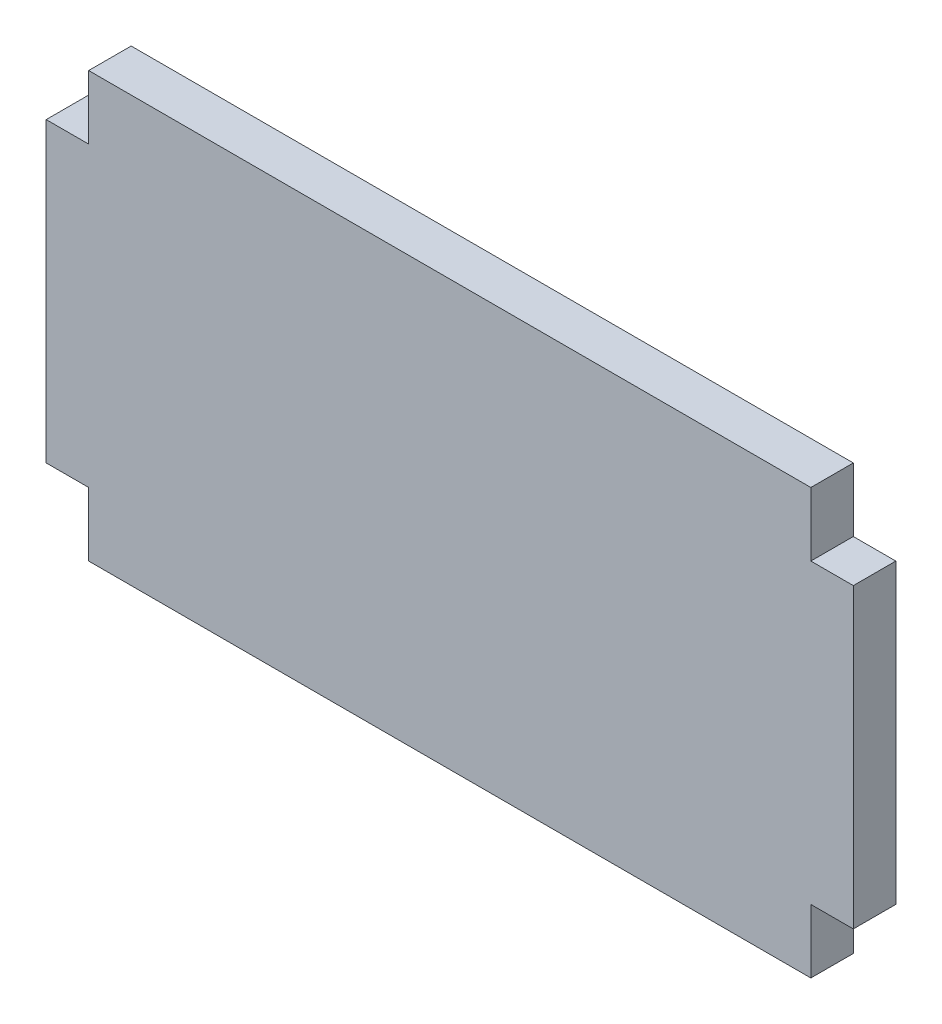
ISO-10303-21;
HEADER;
FILE_DESCRIPTION(('STEP AP214'),'2;1');
FILE_NAME('part.step','',(''),(''),'','','');
FILE_SCHEMA(('AUTOMOTIVE_DESIGN { 1 0 10303 214 1 1 1 1 }'));
ENDSEC;
DATA;
#1=APPLICATION_CONTEXT('core data for automotive mechanical design processes');
#2=APPLICATION_PROTOCOL_DEFINITION('international standard','automotive_design',2000,#1);
#3=PRODUCT_CONTEXT('',#1,'mechanical');
#4=PRODUCT('Part','Part','',(#3));
#5=PRODUCT_RELATED_PRODUCT_CATEGORY('part','',(#4));
#6=PRODUCT_DEFINITION_FORMATION('','',#4);
#7=PRODUCT_DEFINITION_CONTEXT('part definition',#1,'design');
#8=PRODUCT_DEFINITION('design','',#6,#7);
#9=PRODUCT_DEFINITION_SHAPE('','',#8);
#10=(LENGTH_UNIT() NAMED_UNIT(*) SI_UNIT(.MILLI.,.METRE.));
#11=(NAMED_UNIT(*) PLANE_ANGLE_UNIT() SI_UNIT($,.RADIAN.));
#12=(NAMED_UNIT(*) SI_UNIT($,.STERADIAN.) SOLID_ANGLE_UNIT());
#13=UNCERTAINTY_MEASURE_WITH_UNIT(LENGTH_MEASURE(1.E-05),#10,'distance_accuracy_value','');
#14=(GEOMETRIC_REPRESENTATION_CONTEXT(3) GLOBAL_UNCERTAINTY_ASSIGNED_CONTEXT((#13)) GLOBAL_UNIT_ASSIGNED_CONTEXT((#10,
#11,#12)) REPRESENTATION_CONTEXT('',''));
#15=CARTESIAN_POINT('',(0.,0.,0.));
#16=DIRECTION('',(0.,0.,1.));
#17=DIRECTION('',(1.,0.,0.));
#18=AXIS2_PLACEMENT_3D('',#15,#16,#17);
#19=CARTESIAN_POINT('',(42.5,17.5,5.));
#20=DIRECTION('',(-1.,0.,0.));
#21=DIRECTION('',(0.,0.,1.));
#22=AXIS2_PLACEMENT_3D('',#19,#20,#21);
#23=PLANE('',#22);
#24=DIRECTION('',(0.,1.,0.));
#25=VECTOR('',#24,1.);
#26=CARTESIAN_POINT('',(42.5,17.5,0.));
#27=LINE('',#26,#25);
#28=CARTESIAN_POINT('',(42.5,17.5,0.));
#29=VERTEX_POINT('',#28);
#30=CARTESIAN_POINT('',(42.5,25.,0.));
#31=VERTEX_POINT('',#30);
#32=EDGE_CURVE('E153',#29,#31,#27,.T.);
#33=ORIENTED_EDGE('',*,*,#32,.T.);
#34=DIRECTION('',(0.,0.,-1.));
#35=VECTOR('',#34,1.);
#36=CARTESIAN_POINT('',(42.5,25.,5.));
#37=LINE('',#36,#35);
#38=CARTESIAN_POINT('',(42.5,25.,5.));
#39=VERTEX_POINT('',#38);
#40=EDGE_CURVE('E11',#39,#31,#37,.T.);
#41=ORIENTED_EDGE('',*,*,#40,.F.);
#42=DIRECTION('',(0.,1.,0.));
#43=VECTOR('',#42,1.);
#44=CARTESIAN_POINT('',(42.5,17.5,5.));
#45=LINE('',#44,#43);
#46=CARTESIAN_POINT('',(42.5,17.5,5.));
#47=VERTEX_POINT('',#46);
#48=EDGE_CURVE('E175',#47,#39,#45,.T.);
#49=ORIENTED_EDGE('',*,*,#48,.F.);
#50=DIRECTION('',(0.,0.,-1.));
#51=VECTOR('',#50,1.);
#52=CARTESIAN_POINT('',(42.5,17.5,5.));
#53=LINE('',#52,#51);
#54=EDGE_CURVE('E149',#47,#29,#53,.T.);
#55=ORIENTED_EDGE('',*,*,#54,.T.);
#56=EDGE_LOOP('',(#33,#41,#49,#55));
#57=FACE_BOUND('',#56,.T.);
#58=ADVANCED_FACE('F33',(#57),#23,.F.);
#59=CARTESIAN_POINT('',(-42.5,25.,5.));
#60=DIRECTION('',(0.,-1.,0.));
#61=DIRECTION('',(1.,0.,0.));
#62=AXIS2_PLACEMENT_3D('',#59,#60,#61);
#63=PLANE('',#62);
#64=DIRECTION('',(-1.,0.,0.));
#65=VECTOR('',#64,1.);
#66=CARTESIAN_POINT('',(-42.5,25.,0.));
#67=LINE('',#66,#65);
#68=CARTESIAN_POINT('',(-42.5,25.,0.));
#69=VERTEX_POINT('',#68);
#70=EDGE_CURVE('E156',#31,#69,#67,.T.);
#71=ORIENTED_EDGE('',*,*,#70,.T.);
#72=DIRECTION('',(0.,0.,-1.));
#73=VECTOR('',#72,1.);
#74=CARTESIAN_POINT('',(-42.5,25.,5.));
#75=LINE('',#74,#73);
#76=CARTESIAN_POINT('',(-42.5,25.,5.));
#77=VERTEX_POINT('',#76);
#78=EDGE_CURVE('E41',#77,#69,#75,.T.);
#79=ORIENTED_EDGE('',*,*,#78,.F.);
#80=DIRECTION('',(-1.,0.,0.));
#81=VECTOR('',#80,1.);
#82=CARTESIAN_POINT('',(-42.5,25.,5.));
#83=LINE('',#82,#81);
#84=EDGE_CURVE('E104',#39,#77,#83,.T.);
#85=ORIENTED_EDGE('',*,*,#84,.F.);
#86=ORIENTED_EDGE('',*,*,#40,.T.);
#87=EDGE_LOOP('',(#71,#79,#85,#86));
#88=FACE_BOUND('',#87,.T.);
#89=ADVANCED_FACE('F253',(#88),#63,.F.);
#90=CARTESIAN_POINT('',(-42.5,17.5,5.));
#91=DIRECTION('',(1.,0.,0.));
#92=DIRECTION('',(0.,0.,-1.));
#93=AXIS2_PLACEMENT_3D('',#90,#91,#92);
#94=PLANE('',#93);
#95=DIRECTION('',(0.,-1.,0.));
#96=VECTOR('',#95,1.);
#97=CARTESIAN_POINT('',(-42.5,17.5,0.));
#98=LINE('',#97,#96);
#99=CARTESIAN_POINT('',(-42.5,17.5,0.));
#100=VERTEX_POINT('',#99);
#101=EDGE_CURVE('E158',#69,#100,#98,.T.);
#102=ORIENTED_EDGE('',*,*,#101,.T.);
#103=DIRECTION('',(0.,0.,-1.));
#104=VECTOR('',#103,1.);
#105=CARTESIAN_POINT('',(-42.5,17.5,5.));
#106=LINE('',#105,#104);
#107=CARTESIAN_POINT('',(-42.5,17.5,5.));
#108=VERTEX_POINT('',#107);
#109=EDGE_CURVE('E194',#108,#100,#106,.T.);
#110=ORIENTED_EDGE('',*,*,#109,.F.);
#111=DIRECTION('',(0.,-1.,0.));
#112=VECTOR('',#111,1.);
#113=CARTESIAN_POINT('',(-42.5,17.5,5.));
#114=LINE('',#113,#112);
#115=EDGE_CURVE('E202',#77,#108,#114,.T.);
#116=ORIENTED_EDGE('',*,*,#115,.F.);
#117=ORIENTED_EDGE('',*,*,#78,.T.);
#118=EDGE_LOOP('',(#102,#110,#116,#117));
#119=FACE_BOUND('',#118,.T.);
#120=ADVANCED_FACE('F200',(#119),#94,.F.);
#121=CARTESIAN_POINT('',(-47.5,17.5,5.));
#122=DIRECTION('',(0.,-1.,0.));
#123=DIRECTION('',(1.,0.,0.));
#124=AXIS2_PLACEMENT_3D('',#121,#122,#123);
#125=PLANE('',#124);
#126=DIRECTION('',(-1.,0.,0.));
#127=VECTOR('',#126,1.);
#128=CARTESIAN_POINT('',(-47.5,17.5,0.));
#129=LINE('',#128,#127);
#130=CARTESIAN_POINT('',(-47.5,17.5,0.));
#131=VERTEX_POINT('',#130);
#132=EDGE_CURVE('E160',#100,#131,#129,.T.);
#133=ORIENTED_EDGE('',*,*,#132,.T.);
#134=DIRECTION('',(0.,0.,-1.));
#135=VECTOR('',#134,1.);
#136=CARTESIAN_POINT('',(-47.5,17.5,5.));
#137=LINE('',#136,#135);
#138=CARTESIAN_POINT('',(-47.5,17.5,5.));
#139=VERTEX_POINT('',#138);
#140=EDGE_CURVE('E191',#139,#131,#137,.T.);
#141=ORIENTED_EDGE('',*,*,#140,.F.);
#142=DIRECTION('',(-1.,0.,0.));
#143=VECTOR('',#142,1.);
#144=CARTESIAN_POINT('',(-47.5,17.5,5.));
#145=LINE('',#144,#143);
#146=EDGE_CURVE('E220',#108,#139,#145,.T.);
#147=ORIENTED_EDGE('',*,*,#146,.F.);
#148=ORIENTED_EDGE('',*,*,#109,.T.);
#149=EDGE_LOOP('',(#133,#141,#147,#148));
#150=FACE_BOUND('',#149,.T.);
#151=ADVANCED_FACE('F211',(#150),#125,.F.);
#152=CARTESIAN_POINT('',(-47.5,-17.5,5.));
#153=DIRECTION('',(1.,0.,0.));
#154=DIRECTION('',(0.,0.,-1.));
#155=AXIS2_PLACEMENT_3D('',#152,#153,#154);
#156=PLANE('',#155);
#157=DIRECTION('',(0.,-1.,0.));
#158=VECTOR('',#157,1.);
#159=CARTESIAN_POINT('',(-47.5,-17.5,0.));
#160=LINE('',#159,#158);
#161=CARTESIAN_POINT('',(-47.5,-17.5,0.));
#162=VERTEX_POINT('',#161);
#163=EDGE_CURVE('E162',#131,#162,#160,.T.);
#164=ORIENTED_EDGE('',*,*,#163,.T.);
#165=DIRECTION('',(0.,0.,-1.));
#166=VECTOR('',#165,1.);
#167=CARTESIAN_POINT('',(-47.5,-17.5,5.));
#168=LINE('',#167,#166);
#169=CARTESIAN_POINT('',(-47.5,-17.5,5.));
#170=VERTEX_POINT('',#169);
#171=EDGE_CURVE('E188',#170,#162,#168,.T.);
#172=ORIENTED_EDGE('',*,*,#171,.F.);
#173=DIRECTION('',(0.,-1.,0.));
#174=VECTOR('',#173,1.);
#175=CARTESIAN_POINT('',(-47.5,-17.5,5.));
#176=LINE('',#175,#174);
#177=EDGE_CURVE('E217',#139,#170,#176,.T.);
#178=ORIENTED_EDGE('',*,*,#177,.F.);
#179=ORIENTED_EDGE('',*,*,#140,.T.);
#180=EDGE_LOOP('',(#164,#172,#178,#179));
#181=FACE_BOUND('',#180,.T.);
#182=ADVANCED_FACE('F215',(#181),#156,.F.);
#183=CARTESIAN_POINT('',(-47.5,-17.5,5.));
#184=DIRECTION('',(0.,1.,0.));
#185=DIRECTION('',(0.,0.,1.));
#186=AXIS2_PLACEMENT_3D('',#183,#184,#185);
#187=PLANE('',#186);
#188=DIRECTION('',(1.,0.,0.));
#189=VECTOR('',#188,1.);
#190=CARTESIAN_POINT('',(-47.5,-17.5,0.));
#191=LINE('',#190,#189);
#192=CARTESIAN_POINT('',(-42.5,-17.5,0.));
#193=VERTEX_POINT('',#192);
#194=EDGE_CURVE('E164',#162,#193,#191,.T.);
#195=ORIENTED_EDGE('',*,*,#194,.T.);
#196=DIRECTION('',(0.,0.,-1.));
#197=VECTOR('',#196,1.);
#198=CARTESIAN_POINT('',(-42.5,-17.5,5.));
#199=LINE('',#198,#197);
#200=CARTESIAN_POINT('',(-42.5,-17.5,5.));
#201=VERTEX_POINT('',#200);
#202=EDGE_CURVE('E185',#201,#193,#199,.T.);
#203=ORIENTED_EDGE('',*,*,#202,.F.);
#204=DIRECTION('',(1.,0.,0.));
#205=VECTOR('',#204,1.);
#206=CARTESIAN_POINT('',(-47.5,-17.5,5.));
#207=LINE('',#206,#205);
#208=EDGE_CURVE('E219',#170,#201,#207,.T.);
#209=ORIENTED_EDGE('',*,*,#208,.F.);
#210=ORIENTED_EDGE('',*,*,#171,.T.);
#211=EDGE_LOOP('',(#195,#203,#209,#210));
#212=FACE_BOUND('',#211,.T.);
#213=ADVANCED_FACE('F266',(#212),#187,.F.);
#214=CARTESIAN_POINT('',(-42.5,-25.,5.));
#215=DIRECTION('',(1.,0.,0.));
#216=DIRECTION('',(0.,1.,0.));
#217=AXIS2_PLACEMENT_3D('',#214,#215,#216);
#218=PLANE('',#217);
#219=DIRECTION('',(0.,-1.,0.));
#220=VECTOR('',#219,1.);
#221=CARTESIAN_POINT('',(-42.5,-25.,0.));
#222=LINE('',#221,#220);
#223=CARTESIAN_POINT('',(-42.5,-25.,0.));
#224=VERTEX_POINT('',#223);
#225=EDGE_CURVE('E166',#193,#224,#222,.T.);
#226=ORIENTED_EDGE('',*,*,#225,.T.);
#227=DIRECTION('',(0.,0.,-1.));
#228=VECTOR('',#227,1.);
#229=CARTESIAN_POINT('',(-42.5,-25.,5.));
#230=LINE('',#229,#228);
#231=CARTESIAN_POINT('',(-42.5,-25.,5.));
#232=VERTEX_POINT('',#231);
#233=EDGE_CURVE('E182',#232,#224,#230,.T.);
#234=ORIENTED_EDGE('',*,*,#233,.F.);
#235=DIRECTION('',(0.,-1.,0.));
#236=VECTOR('',#235,1.);
#237=CARTESIAN_POINT('',(-42.5,-25.,5.));
#238=LINE('',#237,#236);
#239=EDGE_CURVE('E222',#201,#232,#238,.T.);
#240=ORIENTED_EDGE('',*,*,#239,.F.);
#241=ORIENTED_EDGE('',*,*,#202,.T.);
#242=EDGE_LOOP('',(#226,#234,#240,#241));
#243=FACE_BOUND('',#242,.T.);
#244=ADVANCED_FACE('F269',(#243),#218,.F.);
#245=CARTESIAN_POINT('',(-42.5,-25.,5.));
#246=DIRECTION('',(0.,1.,0.));
#247=DIRECTION('',(0.,0.,1.));
#248=AXIS2_PLACEMENT_3D('',#245,#246,#247);
#249=PLANE('',#248);
#250=DIRECTION('',(1.,0.,0.));
#251=VECTOR('',#250,1.);
#252=CARTESIAN_POINT('',(-42.5,-25.,0.));
#253=LINE('',#252,#251);
#254=CARTESIAN_POINT('',(42.5,-25.,0.));
#255=VERTEX_POINT('',#254);
#256=EDGE_CURVE('E168',#224,#255,#253,.T.);
#257=ORIENTED_EDGE('',*,*,#256,.T.);
#258=DIRECTION('',(0.,0.,-1.));
#259=VECTOR('',#258,1.);
#260=CARTESIAN_POINT('',(42.5,-25.,5.));
#261=LINE('',#260,#259);
#262=CARTESIAN_POINT('',(42.5,-25.,5.));
#263=VERTEX_POINT('',#262);
#264=EDGE_CURVE('E179',#263,#255,#261,.T.);
#265=ORIENTED_EDGE('',*,*,#264,.F.);
#266=DIRECTION('',(1.,0.,0.));
#267=VECTOR('',#266,1.);
#268=CARTESIAN_POINT('',(-42.5,-25.,5.));
#269=LINE('',#268,#267);
#270=EDGE_CURVE('E228',#232,#263,#269,.T.);
#271=ORIENTED_EDGE('',*,*,#270,.F.);
#272=ORIENTED_EDGE('',*,*,#233,.T.);
#273=EDGE_LOOP('',(#257,#265,#271,#272));
#274=FACE_BOUND('',#273,.T.);
#275=ADVANCED_FACE('F234',(#274),#249,.F.);
#276=CARTESIAN_POINT('',(42.5,-25.,5.));
#277=DIRECTION('',(-1.,0.,0.));
#278=DIRECTION('',(0.,-1.,0.));
#279=AXIS2_PLACEMENT_3D('',#276,#277,#278);
#280=PLANE('',#279);
#281=DIRECTION('',(0.,1.,0.));
#282=VECTOR('',#281,1.);
#283=CARTESIAN_POINT('',(42.5,-25.,0.));
#284=LINE('',#283,#282);
#285=CARTESIAN_POINT('',(42.5,-17.5,0.));
#286=VERTEX_POINT('',#285);
#287=EDGE_CURVE('E170',#255,#286,#284,.T.);
#288=ORIENTED_EDGE('',*,*,#287,.T.);
#289=DIRECTION('',(0.,0.,-1.));
#290=VECTOR('',#289,1.);
#291=CARTESIAN_POINT('',(42.5,-17.5,5.));
#292=LINE('',#291,#290);
#293=CARTESIAN_POINT('',(42.5,-17.5,5.));
#294=VERTEX_POINT('',#293);
#295=EDGE_CURVE('E144',#294,#286,#292,.T.);
#296=ORIENTED_EDGE('',*,*,#295,.F.);
#297=DIRECTION('',(0.,1.,0.));
#298=VECTOR('',#297,1.);
#299=CARTESIAN_POINT('',(42.5,-25.,5.));
#300=LINE('',#299,#298);
#301=EDGE_CURVE('E135',#263,#294,#300,.T.);
#302=ORIENTED_EDGE('',*,*,#301,.F.);
#303=ORIENTED_EDGE('',*,*,#264,.T.);
#304=EDGE_LOOP('',(#288,#296,#302,#303));
#305=FACE_BOUND('',#304,.T.);
#306=ADVANCED_FACE('F238',(#305),#280,.F.);
#307=CARTESIAN_POINT('',(42.5,-17.5,5.));
#308=DIRECTION('',(0.,1.,0.));
#309=DIRECTION('',(-1.,0.,0.));
#310=AXIS2_PLACEMENT_3D('',#307,#308,#309);
#311=PLANE('',#310);
#312=DIRECTION('',(1.,0.,0.));
#313=VECTOR('',#312,1.);
#314=CARTESIAN_POINT('',(42.5,-17.5,0.));
#315=LINE('',#314,#313);
#316=CARTESIAN_POINT('',(47.5,-17.5,0.));
#317=VERTEX_POINT('',#316);
#318=EDGE_CURVE('E143',#286,#317,#315,.T.);
#319=ORIENTED_EDGE('',*,*,#318,.T.);
#320=DIRECTION('',(0.,0.,-1.));
#321=VECTOR('',#320,1.);
#322=CARTESIAN_POINT('',(47.5,-17.5,5.));
#323=LINE('',#322,#321);
#324=CARTESIAN_POINT('',(47.5,-17.5,5.));
#325=VERTEX_POINT('',#324);
#326=EDGE_CURVE('E140',#325,#317,#323,.T.);
#327=ORIENTED_EDGE('',*,*,#326,.F.);
#328=DIRECTION('',(1.,0.,0.));
#329=VECTOR('',#328,1.);
#330=CARTESIAN_POINT('',(42.5,-17.5,5.));
#331=LINE('',#330,#329);
#332=EDGE_CURVE('E129',#294,#325,#331,.T.);
#333=ORIENTED_EDGE('',*,*,#332,.F.);
#334=ORIENTED_EDGE('',*,*,#295,.T.);
#335=EDGE_LOOP('',(#319,#327,#333,#334));
#336=FACE_BOUND('',#335,.T.);
#337=ADVANCED_FACE('F141',(#336),#311,.F.);
#338=CARTESIAN_POINT('',(47.5,-17.5,5.));
#339=DIRECTION('',(-1.,0.,0.));
#340=DIRECTION('',(0.,0.,1.));
#341=AXIS2_PLACEMENT_3D('',#338,#339,#340);
#342=PLANE('',#341);
#343=DIRECTION('',(0.,1.,0.));
#344=VECTOR('',#343,1.);
#345=CARTESIAN_POINT('',(47.5,-17.5,0.));
#346=LINE('',#345,#344);
#347=CARTESIAN_POINT('',(47.5,17.5,0.));
#348=VERTEX_POINT('',#347);
#349=EDGE_CURVE('E90',#317,#348,#346,.T.);
#350=ORIENTED_EDGE('',*,*,#349,.T.);
#351=DIRECTION('',(0.,0.,-1.));
#352=VECTOR('',#351,1.);
#353=CARTESIAN_POINT('',(47.5,17.5,5.));
#354=LINE('',#353,#352);
#355=CARTESIAN_POINT('',(47.5,17.5,5.));
#356=VERTEX_POINT('',#355);
#357=EDGE_CURVE('E145',#356,#348,#354,.T.);
#358=ORIENTED_EDGE('',*,*,#357,.F.);
#359=DIRECTION('',(0.,1.,0.));
#360=VECTOR('',#359,1.);
#361=CARTESIAN_POINT('',(47.5,-17.5,5.));
#362=LINE('',#361,#360);
#363=EDGE_CURVE('E133',#325,#356,#362,.T.);
#364=ORIENTED_EDGE('',*,*,#363,.F.);
#365=ORIENTED_EDGE('',*,*,#326,.T.);
#366=EDGE_LOOP('',(#350,#358,#364,#365));
#367=FACE_BOUND('',#366,.T.);
#368=ADVANCED_FACE('F147',(#367),#342,.F.);
#369=CARTESIAN_POINT('',(42.5,17.5,5.));
#370=DIRECTION('',(0.,-1.,0.));
#371=DIRECTION('',(1.,0.,0.));
#372=AXIS2_PLACEMENT_3D('',#369,#370,#371);
#373=PLANE('',#372);
#374=DIRECTION('',(-1.,0.,0.));
#375=VECTOR('',#374,1.);
#376=CARTESIAN_POINT('',(42.5,17.5,0.));
#377=LINE('',#376,#375);
#378=EDGE_CURVE('E96',#348,#29,#377,.T.);
#379=ORIENTED_EDGE('',*,*,#378,.T.);
#380=ORIENTED_EDGE('',*,*,#54,.F.);
#381=DIRECTION('',(-1.,0.,0.));
#382=VECTOR('',#381,1.);
#383=CARTESIAN_POINT('',(42.5,17.5,5.));
#384=LINE('',#383,#382);
#385=EDGE_CURVE('E49',#356,#47,#384,.T.);
#386=ORIENTED_EDGE('',*,*,#385,.F.);
#387=ORIENTED_EDGE('',*,*,#357,.T.);
#388=EDGE_LOOP('',(#379,#380,#386,#387));
#389=FACE_BOUND('',#388,.T.);
#390=ADVANCED_FACE('F242',(#389),#373,.F.);
#391=CARTESIAN_POINT('',(0.,0.,5.));
#392=DIRECTION('',(0.,0.,-1.));
#393=DIRECTION('',(-1.,0.,0.));
#394=AXIS2_PLACEMENT_3D('',#391,#392,#393);
#395=PLANE('',#394);
#396=ORIENTED_EDGE('',*,*,#48,.T.);
#397=ORIENTED_EDGE('',*,*,#84,.T.);
#398=ORIENTED_EDGE('',*,*,#115,.T.);
#399=ORIENTED_EDGE('',*,*,#146,.T.);
#400=ORIENTED_EDGE('',*,*,#177,.T.);
#401=ORIENTED_EDGE('',*,*,#208,.T.);
#402=ORIENTED_EDGE('',*,*,#239,.T.);
#403=ORIENTED_EDGE('',*,*,#270,.T.);
#404=ORIENTED_EDGE('',*,*,#301,.T.);
#405=ORIENTED_EDGE('',*,*,#332,.T.);
#406=ORIENTED_EDGE('',*,*,#363,.T.);
#407=ORIENTED_EDGE('',*,*,#385,.T.);
#408=EDGE_LOOP('',(#396,#397,#398,#399,#400,#401,#402,#403,#404,#405,#406,#407));
#409=FACE_BOUND('',#408,.T.);
#410=ADVANCED_FACE('F131',(#409),#395,.F.);
#411=CARTESIAN_POINT('',(0.,0.,0.));
#412=DIRECTION('',(0.,0.,-1.));
#413=DIRECTION('',(-1.,0.,0.));
#414=AXIS2_PLACEMENT_3D('',#411,#412,#413);
#415=PLANE('',#414);
#416=ORIENTED_EDGE('',*,*,#32,.F.);
#417=ORIENTED_EDGE('',*,*,#378,.F.);
#418=ORIENTED_EDGE('',*,*,#349,.F.);
#419=ORIENTED_EDGE('',*,*,#318,.F.);
#420=ORIENTED_EDGE('',*,*,#287,.F.);
#421=ORIENTED_EDGE('',*,*,#256,.F.);
#422=ORIENTED_EDGE('',*,*,#225,.F.);
#423=ORIENTED_EDGE('',*,*,#194,.F.);
#424=ORIENTED_EDGE('',*,*,#163,.F.);
#425=ORIENTED_EDGE('',*,*,#132,.F.);
#426=ORIENTED_EDGE('',*,*,#101,.F.);
#427=ORIENTED_EDGE('',*,*,#70,.F.);
#428=EDGE_LOOP('',(#416,#417,#418,#419,#420,#421,#422,#423,#424,#425,#426,#427));
#429=FACE_BOUND('',#428,.T.);
#430=ADVANCED_FACE('F206',(#429),#415,.T.);
#431=CLOSED_SHELL('',(#58,#89,#120,#151,#182,#213,#244,#275,#306,#337,#368,#390,#410,#430));
#432=MANIFOLD_SOLID_BREP('B2',#431);
#433=ADVANCED_BREP_SHAPE_REPRESENTATION('',(#18,#432),#14);
#434=SHAPE_DEFINITION_REPRESENTATION(#9,#433);
ENDSEC;
END-ISO-10303-21;
